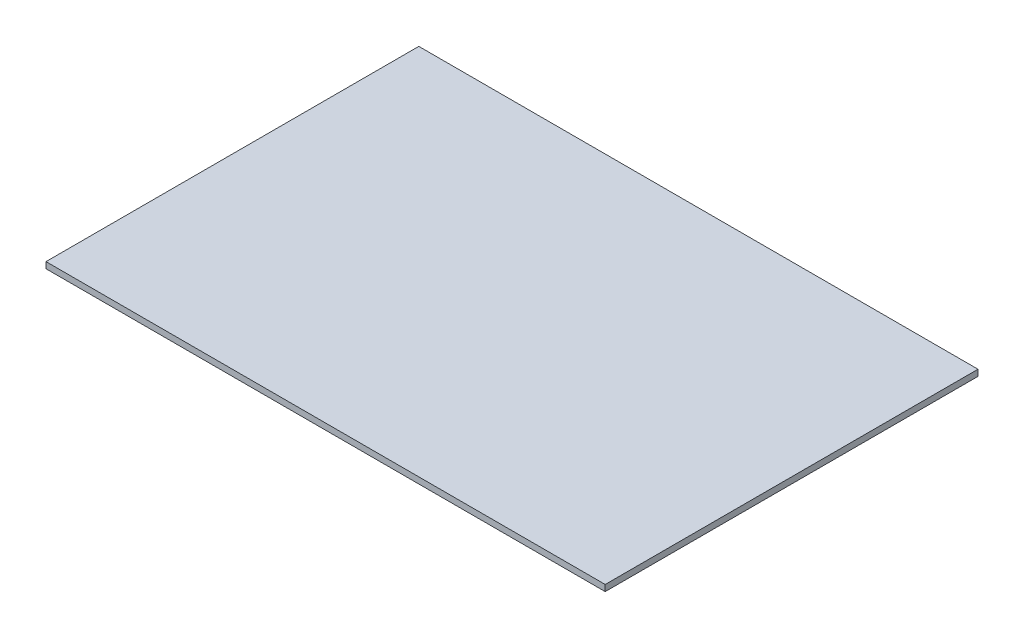
ISO-10303-21;
HEADER;
FILE_DESCRIPTION(('STEP AP214'),'2;1');
FILE_NAME('part.step','',(''),(''),'','','');
FILE_SCHEMA(('AUTOMOTIVE_DESIGN { 1 0 10303 214 1 1 1 1 }'));
ENDSEC;
DATA;
#1=APPLICATION_CONTEXT('core data for automotive mechanical design processes');
#2=APPLICATION_PROTOCOL_DEFINITION('international standard','automotive_design',2000,#1);
#3=PRODUCT_CONTEXT('',#1,'mechanical');
#4=PRODUCT('Part','Part','',(#3));
#5=PRODUCT_RELATED_PRODUCT_CATEGORY('part','',(#4));
#6=PRODUCT_DEFINITION_FORMATION('','',#4);
#7=PRODUCT_DEFINITION_CONTEXT('part definition',#1,'design');
#8=PRODUCT_DEFINITION('design','',#6,#7);
#9=PRODUCT_DEFINITION_SHAPE('','',#8);
#10=(LENGTH_UNIT() NAMED_UNIT(*) SI_UNIT(.MILLI.,.METRE.));
#11=(NAMED_UNIT(*) PLANE_ANGLE_UNIT() SI_UNIT($,.RADIAN.));
#12=(NAMED_UNIT(*) SI_UNIT($,.STERADIAN.) SOLID_ANGLE_UNIT());
#13=UNCERTAINTY_MEASURE_WITH_UNIT(LENGTH_MEASURE(1.E-05),#10,'distance_accuracy_value','');
#14=(GEOMETRIC_REPRESENTATION_CONTEXT(3) GLOBAL_UNCERTAINTY_ASSIGNED_CONTEXT((#13)) GLOBAL_UNIT_ASSIGNED_CONTEXT((#10,
#11,#12)) REPRESENTATION_CONTEXT('',''));
#15=CARTESIAN_POINT('',(0.,0.,0.));
#16=DIRECTION('',(0.,0.,1.));
#17=DIRECTION('',(1.,0.,0.));
#18=AXIS2_PLACEMENT_3D('',#15,#16,#17);
#19=CARTESIAN_POINT('',(-45.,1.,-30.));
#20=DIRECTION('',(1.,0.,0.));
#21=DIRECTION('',(0.,0.,-1.));
#22=AXIS2_PLACEMENT_3D('',#19,#20,#21);
#23=PLANE('',#22);
#24=DIRECTION('',(0.,0.,1.));
#25=VECTOR('',#24,1.);
#26=CARTESIAN_POINT('',(-45.,0.,-30.));
#27=LINE('',#26,#25);
#28=CARTESIAN_POINT('',(-45.,0.,-30.));
#29=VERTEX_POINT('',#28);
#30=CARTESIAN_POINT('',(-45.,0.,30.));
#31=VERTEX_POINT('',#30);
#32=EDGE_CURVE('E100',#29,#31,#27,.T.);
#33=ORIENTED_EDGE('',*,*,#32,.T.);
#34=DIRECTION('',(0.,-1.,0.));
#35=VECTOR('',#34,1.);
#36=CARTESIAN_POINT('',(-45.,1.,30.));
#37=LINE('',#36,#35);
#38=CARTESIAN_POINT('',(-45.,1.,30.));
#39=VERTEX_POINT('',#38);
#40=EDGE_CURVE('E11',#39,#31,#37,.T.);
#41=ORIENTED_EDGE('',*,*,#40,.F.);
#42=DIRECTION('',(0.,0.,1.));
#43=VECTOR('',#42,1.);
#44=CARTESIAN_POINT('',(-45.,1.,-30.));
#45=LINE('',#44,#43);
#46=CARTESIAN_POINT('',(-45.,1.,-30.));
#47=VERTEX_POINT('',#46);
#48=EDGE_CURVE('E88',#47,#39,#45,.T.);
#49=ORIENTED_EDGE('',*,*,#48,.F.);
#50=DIRECTION('',(0.,-1.,0.));
#51=VECTOR('',#50,1.);
#52=CARTESIAN_POINT('',(-45.,1.,-30.));
#53=LINE('',#52,#51);
#54=EDGE_CURVE('E96',#47,#29,#53,.T.);
#55=ORIENTED_EDGE('',*,*,#54,.T.);
#56=EDGE_LOOP('',(#33,#41,#49,#55));
#57=FACE_BOUND('',#56,.T.);
#58=ADVANCED_FACE('F37',(#57),#23,.F.);
#59=CARTESIAN_POINT('',(-45.,1.,30.));
#60=DIRECTION('',(0.,0.,-1.));
#61=DIRECTION('',(-1.,0.,0.));
#62=AXIS2_PLACEMENT_3D('',#59,#60,#61);
#63=PLANE('',#62);
#64=DIRECTION('',(1.,0.,0.));
#65=VECTOR('',#64,1.);
#66=CARTESIAN_POINT('',(-45.,0.,30.));
#67=LINE('',#66,#65);
#68=CARTESIAN_POINT('',(45.,0.,30.));
#69=VERTEX_POINT('',#68);
#70=EDGE_CURVE('E92',#31,#69,#67,.T.);
#71=ORIENTED_EDGE('',*,*,#70,.T.);
#72=DIRECTION('',(0.,-1.,0.));
#73=VECTOR('',#72,1.);
#74=CARTESIAN_POINT('',(45.,1.,30.));
#75=LINE('',#74,#73);
#76=CARTESIAN_POINT('',(45.,1.,30.));
#77=VERTEX_POINT('',#76);
#78=EDGE_CURVE('E45',#77,#69,#75,.T.);
#79=ORIENTED_EDGE('',*,*,#78,.F.);
#80=DIRECTION('',(1.,0.,0.));
#81=VECTOR('',#80,1.);
#82=CARTESIAN_POINT('',(-45.,1.,30.));
#83=LINE('',#82,#81);
#84=EDGE_CURVE('E83',#39,#77,#83,.T.);
#85=ORIENTED_EDGE('',*,*,#84,.F.);
#86=ORIENTED_EDGE('',*,*,#40,.T.);
#87=EDGE_LOOP('',(#71,#79,#85,#86));
#88=FACE_BOUND('',#87,.T.);
#89=ADVANCED_FACE('F91',(#88),#63,.F.);
#90=CARTESIAN_POINT('',(45.,1.,-30.));
#91=DIRECTION('',(-1.,0.,0.));
#92=DIRECTION('',(0.,0.,1.));
#93=AXIS2_PLACEMENT_3D('',#90,#91,#92);
#94=PLANE('',#93);
#95=DIRECTION('',(0.,0.,-1.));
#96=VECTOR('',#95,1.);
#97=CARTESIAN_POINT('',(45.,0.,-30.));
#98=LINE('',#97,#96);
#99=CARTESIAN_POINT('',(45.,0.,-30.));
#100=VERTEX_POINT('',#99);
#101=EDGE_CURVE('E70',#69,#100,#98,.T.);
#102=ORIENTED_EDGE('',*,*,#101,.T.);
#103=DIRECTION('',(0.,-1.,0.));
#104=VECTOR('',#103,1.);
#105=CARTESIAN_POINT('',(45.,1.,-30.));
#106=LINE('',#105,#104);
#107=CARTESIAN_POINT('',(45.,1.,-30.));
#108=VERTEX_POINT('',#107);
#109=EDGE_CURVE('E93',#108,#100,#106,.T.);
#110=ORIENTED_EDGE('',*,*,#109,.F.);
#111=DIRECTION('',(0.,0.,-1.));
#112=VECTOR('',#111,1.);
#113=CARTESIAN_POINT('',(45.,1.,-30.));
#114=LINE('',#113,#112);
#115=EDGE_CURVE('E86',#77,#108,#114,.T.);
#116=ORIENTED_EDGE('',*,*,#115,.F.);
#117=ORIENTED_EDGE('',*,*,#78,.T.);
#118=EDGE_LOOP('',(#102,#110,#116,#117));
#119=FACE_BOUND('',#118,.T.);
#120=ADVANCED_FACE('F94',(#119),#94,.F.);
#121=CARTESIAN_POINT('',(-45.,1.,-30.));
#122=DIRECTION('',(0.,0.,1.));
#123=DIRECTION('',(1.,0.,0.));
#124=AXIS2_PLACEMENT_3D('',#121,#122,#123);
#125=PLANE('',#124);
#126=DIRECTION('',(-1.,0.,0.));
#127=VECTOR('',#126,1.);
#128=CARTESIAN_POINT('',(-45.,0.,-30.));
#129=LINE('',#128,#127);
#130=EDGE_CURVE('E76',#100,#29,#129,.T.);
#131=ORIENTED_EDGE('',*,*,#130,.T.);
#132=ORIENTED_EDGE('',*,*,#54,.F.);
#133=DIRECTION('',(-1.,0.,0.));
#134=VECTOR('',#133,1.);
#135=CARTESIAN_POINT('',(-45.,1.,-30.));
#136=LINE('',#135,#134);
#137=EDGE_CURVE('E53',#108,#47,#136,.T.);
#138=ORIENTED_EDGE('',*,*,#137,.F.);
#139=ORIENTED_EDGE('',*,*,#109,.T.);
#140=EDGE_LOOP('',(#131,#132,#138,#139));
#141=FACE_BOUND('',#140,.T.);
#142=ADVANCED_FACE('F107',(#141),#125,.F.);
#143=CARTESIAN_POINT('',(0.,1.,0.));
#144=DIRECTION('',(0.,1.,0.));
#145=DIRECTION('',(0.,0.,1.));
#146=AXIS2_PLACEMENT_3D('',#143,#144,#145);
#147=PLANE('',#146);
#148=ORIENTED_EDGE('',*,*,#48,.T.);
#149=ORIENTED_EDGE('',*,*,#84,.T.);
#150=ORIENTED_EDGE('',*,*,#115,.T.);
#151=ORIENTED_EDGE('',*,*,#137,.T.);
#152=EDGE_LOOP('',(#148,#149,#150,#151));
#153=FACE_BOUND('',#152,.T.);
#154=ADVANCED_FACE('F84',(#153),#147,.T.);
#155=CARTESIAN_POINT('',(0.,0.,0.));
#156=DIRECTION('',(0.,1.,0.));
#157=DIRECTION('',(0.,0.,1.));
#158=AXIS2_PLACEMENT_3D('',#155,#156,#157);
#159=PLANE('',#158);
#160=ORIENTED_EDGE('',*,*,#32,.F.);
#161=ORIENTED_EDGE('',*,*,#130,.F.);
#162=ORIENTED_EDGE('',*,*,#101,.F.);
#163=ORIENTED_EDGE('',*,*,#70,.F.);
#164=EDGE_LOOP('',(#160,#161,#162,#163));
#165=FACE_BOUND('',#164,.T.);
#166=ADVANCED_FACE('F110',(#165),#159,.F.);
#167=CLOSED_SHELL('',(#58,#89,#120,#142,#154,#166));
#168=MANIFOLD_SOLID_BREP('B2',#167);
#169=ADVANCED_BREP_SHAPE_REPRESENTATION('',(#18,#168),#14);
#170=SHAPE_DEFINITION_REPRESENTATION(#9,#169);
ENDSEC;
END-ISO-10303-21;
